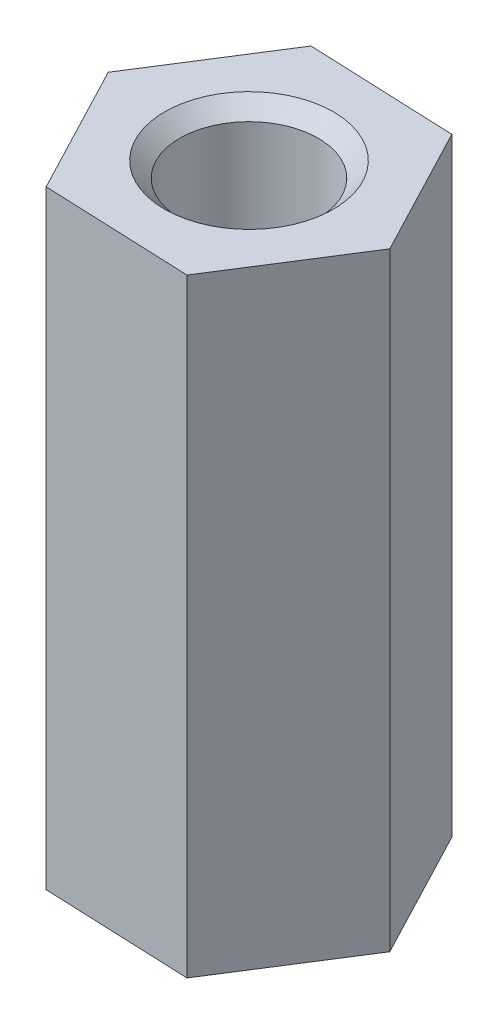
ISO-10303-21;
HEADER;
FILE_DESCRIPTION(('STEP AP214'),'2;1');
FILE_NAME('part.step','',(''),(''),'','','');
FILE_SCHEMA(('AUTOMOTIVE_DESIGN { 1 0 10303 214 1 1 1 1 }'));
ENDSEC;
DATA;
#1=APPLICATION_CONTEXT('core data for automotive mechanical design processes');
#2=APPLICATION_PROTOCOL_DEFINITION('international standard','automotive_design',2000,#1);
#3=PRODUCT_CONTEXT('',#1,'mechanical');
#4=PRODUCT('Part','Part','',(#3));
#5=PRODUCT_RELATED_PRODUCT_CATEGORY('part','',(#4));
#6=PRODUCT_DEFINITION_FORMATION('','',#4);
#7=PRODUCT_DEFINITION_CONTEXT('part definition',#1,'design');
#8=PRODUCT_DEFINITION('design','',#6,#7);
#9=PRODUCT_DEFINITION_SHAPE('','',#8);
#10=(LENGTH_UNIT() NAMED_UNIT(*) SI_UNIT(.MILLI.,.METRE.));
#11=(NAMED_UNIT(*) PLANE_ANGLE_UNIT() SI_UNIT($,.RADIAN.));
#12=(NAMED_UNIT(*) SI_UNIT($,.STERADIAN.) SOLID_ANGLE_UNIT());
#13=UNCERTAINTY_MEASURE_WITH_UNIT(LENGTH_MEASURE(1.E-05),#10,'distance_accuracy_value','');
#14=(GEOMETRIC_REPRESENTATION_CONTEXT(3) GLOBAL_UNCERTAINTY_ASSIGNED_CONTEXT((#13)) GLOBAL_UNIT_ASSIGNED_CONTEXT((#10,
#11,#12)) REPRESENTATION_CONTEXT('',''));
#15=CARTESIAN_POINT('',(0.,0.,0.));
#16=DIRECTION('',(0.,0.,1.));
#17=DIRECTION('',(1.,0.,0.));
#18=AXIS2_PLACEMENT_3D('',#15,#16,#17);
#19=CARTESIAN_POINT('',(0.,11.,0.));
#20=DIRECTION('',(0.,1.,0.));
#21=DIRECTION('',(0.,0.,1.));
#22=AXIS2_PLACEMENT_3D('',#19,#20,#21);
#23=PLANE('',#22);
#24=CARTESIAN_POINT('',(0.,11.,0.));
#25=DIRECTION('',(0.,1.,0.));
#26=DIRECTION('',(0.,0.,1.));
#27=AXIS2_PLACEMENT_3D('',#24,#25,#26);
#28=CIRCLE('',#27,1.525);
#29=CARTESIAN_POINT('',(0.,11.,1.525));
#30=VERTEX_POINT('',#29);
#31=EDGE_CURVE('E179',#30,#30,#28,.T.);
#32=ORIENTED_EDGE('',*,*,#31,.F.);
#33=EDGE_LOOP('',(#32));
#34=FACE_BOUND('',#33,.T.);
#35=DIRECTION('',(0.999145776971958,0.,0.0413245249107971));
#36=VECTOR('',#35,1.);
#37=CARTESIAN_POINT('',(-1.42181769887204,11.,2.24316021819832));
#38=LINE('',#37,#36);
#39=CARTESIAN_POINT('',(-1.42181769887204,11.,2.24316021819832));
#40=VERTEX_POINT('',#39);
#41=CARTESIAN_POINT('',(1.23172488428237,11.,2.35291035587268));
#42=VERTEX_POINT('',#41);
#43=EDGE_CURVE('E135',#40,#42,#38,.T.);
#44=ORIENTED_EDGE('',*,*,#43,.T.);
#45=DIRECTION('',(0.535360976858052,0.,-0.844623362486258));
#46=VECTOR('',#45,1.);
#47=CARTESIAN_POINT('',(1.23172488428237,11.,2.35291035587268));
#48=LINE('',#47,#46);
#49=CARTESIAN_POINT('',(2.65354258315441,11.,0.109750137674357));
#50=VERTEX_POINT('',#49);
#51=EDGE_CURVE('E94',#42,#50,#48,.T.);
#52=ORIENTED_EDGE('',*,*,#51,.T.);
#53=DIRECTION('',(-0.463784800113906,0.,-0.885947887397055));
#54=VECTOR('',#53,1.);
#55=CARTESIAN_POINT('',(2.65354258315441,11.,0.109750137674357));
#56=LINE('',#55,#54);
#57=CARTESIAN_POINT('',(1.42181769887204,11.,-2.24316021819832));
#58=VERTEX_POINT('',#57);
#59=EDGE_CURVE('E106',#50,#58,#56,.T.);
#60=ORIENTED_EDGE('',*,*,#59,.T.);
#61=DIRECTION('',(-0.999145776971957,0.,-0.0413245249107969));
#62=VECTOR('',#61,1.);
#63=CARTESIAN_POINT('',(1.42181769887204,11.,-2.24316021819832));
#64=LINE('',#63,#62);
#65=CARTESIAN_POINT('',(-1.23172488428237,11.,-2.35291035587268));
#66=VERTEX_POINT('',#65);
#67=EDGE_CURVE('E101',#58,#66,#64,.T.);
#68=ORIENTED_EDGE('',*,*,#67,.T.);
#69=DIRECTION('',(-0.535360976858052,0.,0.844623362486258));
#70=VECTOR('',#69,1.);
#71=CARTESIAN_POINT('',(-1.23172488428237,11.,-2.35291035587268));
#72=LINE('',#71,#70);
#73=CARTESIAN_POINT('',(-2.65354258315441,11.,-0.109750137674357));
#74=VERTEX_POINT('',#73);
#75=EDGE_CURVE('E104',#66,#74,#72,.T.);
#76=ORIENTED_EDGE('',*,*,#75,.T.);
#77=DIRECTION('',(0.463784800113906,0.,0.885947887397055));
#78=VECTOR('',#77,1.);
#79=CARTESIAN_POINT('',(-2.65354258315441,11.,-0.109750137674357));
#80=LINE('',#79,#78);
#81=EDGE_CURVE('E57',#74,#40,#80,.T.);
#82=ORIENTED_EDGE('',*,*,#81,.T.);
#83=EDGE_LOOP('',(#44,#52,#60,#68,#76,#82));
#84=FACE_BOUND('',#83,.T.);
#85=ADVANCED_FACE('F40',(#34,#84),#23,.T.);
#86=CARTESIAN_POINT('',(0.,0.,0.));
#87=DIRECTION('',(0.,1.,0.));
#88=DIRECTION('',(0.,0.,1.));
#89=AXIS2_PLACEMENT_3D('',#86,#87,#88);
#90=PLANE('',#89);
#91=CARTESIAN_POINT('',(0.,0.,0.));
#92=DIRECTION('',(0.,1.,0.));
#93=DIRECTION('',(0.,0.,1.));
#94=AXIS2_PLACEMENT_3D('',#91,#92,#93);
#95=CIRCLE('',#94,1.25);
#96=CARTESIAN_POINT('',(0.,0.,1.25));
#97=VERTEX_POINT('',#96);
#98=EDGE_CURVE('E128',#97,#97,#95,.T.);
#99=ORIENTED_EDGE('',*,*,#98,.T.);
#100=EDGE_LOOP('',(#99));
#101=FACE_BOUND('',#100,.T.);
#102=DIRECTION('',(0.999145776971958,0.,0.0413245249107971));
#103=VECTOR('',#102,1.);
#104=CARTESIAN_POINT('',(-1.42181769887204,0.,2.24316021819832));
#105=LINE('',#104,#103);
#106=CARTESIAN_POINT('',(-1.42181769887204,0.,2.24316021819832));
#107=VERTEX_POINT('',#106);
#108=CARTESIAN_POINT('',(1.23172488428237,0.,2.35291035587268));
#109=VERTEX_POINT('',#108);
#110=EDGE_CURVE('E124',#107,#109,#105,.T.);
#111=ORIENTED_EDGE('',*,*,#110,.F.);
#112=DIRECTION('',(0.463784800113906,0.,0.885947887397055));
#113=VECTOR('',#112,1.);
#114=CARTESIAN_POINT('',(-2.65354258315441,0.,-0.109750137674357));
#115=LINE('',#114,#113);
#116=CARTESIAN_POINT('',(-2.65354258315441,0.,-0.109750137674357));
#117=VERTEX_POINT('',#116);
#118=EDGE_CURVE('E86',#117,#107,#115,.T.);
#119=ORIENTED_EDGE('',*,*,#118,.F.);
#120=DIRECTION('',(-0.535360976858052,0.,0.844623362486258));
#121=VECTOR('',#120,1.);
#122=CARTESIAN_POINT('',(-1.23172488428237,0.,-2.35291035587268));
#123=LINE('',#122,#121);
#124=CARTESIAN_POINT('',(-1.23172488428237,0.,-2.35291035587268));
#125=VERTEX_POINT('',#124);
#126=EDGE_CURVE('E80',#125,#117,#123,.T.);
#127=ORIENTED_EDGE('',*,*,#126,.F.);
#128=DIRECTION('',(-0.999145776971957,0.,-0.0413245249107969));
#129=VECTOR('',#128,1.);
#130=CARTESIAN_POINT('',(1.42181769887204,0.,-2.24316021819832));
#131=LINE('',#130,#129);
#132=CARTESIAN_POINT('',(1.42181769887204,0.,-2.24316021819832));
#133=VERTEX_POINT('',#132);
#134=EDGE_CURVE('E114',#133,#125,#131,.T.);
#135=ORIENTED_EDGE('',*,*,#134,.F.);
#136=DIRECTION('',(-0.463784800113906,0.,-0.885947887397055));
#137=VECTOR('',#136,1.);
#138=CARTESIAN_POINT('',(2.65354258315441,0.,0.109750137674357));
#139=LINE('',#138,#137);
#140=CARTESIAN_POINT('',(2.65354258315441,0.,0.109750137674357));
#141=VERTEX_POINT('',#140);
#142=EDGE_CURVE('E130',#141,#133,#139,.T.);
#143=ORIENTED_EDGE('',*,*,#142,.F.);
#144=DIRECTION('',(0.535360976858052,0.,-0.844623362486258));
#145=VECTOR('',#144,1.);
#146=CARTESIAN_POINT('',(1.23172488428237,0.,2.35291035587268));
#147=LINE('',#146,#145);
#148=EDGE_CURVE('E127',#109,#141,#147,.T.);
#149=ORIENTED_EDGE('',*,*,#148,.F.);
#150=EDGE_LOOP('',(#111,#119,#127,#135,#143,#149));
#151=FACE_BOUND('',#150,.T.);
#152=ADVANCED_FACE('F144',(#101,#151),#90,.F.);
#153=CARTESIAN_POINT('',(-1.42181769887204,11.,2.24316021819832));
#154=DIRECTION('',(0.0413245249107971,0.,-0.999145776971958));
#155=DIRECTION('',(-0.999145776971958,0.,-0.0413245249107971));
#156=AXIS2_PLACEMENT_3D('',#153,#154,#155);
#157=PLANE('',#156);
#158=ORIENTED_EDGE('',*,*,#110,.T.);
#159=DIRECTION('',(0.,-1.,0.));
#160=VECTOR('',#159,1.);
#161=CARTESIAN_POINT('',(1.23172488428237,11.,2.35291035587268));
#162=LINE('',#161,#160);
#163=EDGE_CURVE('E11',#42,#109,#162,.T.);
#164=ORIENTED_EDGE('',*,*,#163,.F.);
#165=ORIENTED_EDGE('',*,*,#43,.F.);
#166=DIRECTION('',(0.,-1.,0.));
#167=VECTOR('',#166,1.);
#168=CARTESIAN_POINT('',(-1.42181769887204,11.,2.24316021819832));
#169=LINE('',#168,#167);
#170=EDGE_CURVE('E120',#40,#107,#169,.T.);
#171=ORIENTED_EDGE('',*,*,#170,.T.);
#172=EDGE_LOOP('',(#158,#164,#165,#171));
#173=FACE_BOUND('',#172,.T.);
#174=ADVANCED_FACE('F42',(#173),#157,.F.);
#175=CARTESIAN_POINT('',(1.23172488428237,11.,2.35291035587268));
#176=DIRECTION('',(-0.844623362486258,0.,-0.535360976858052));
#177=DIRECTION('',(-0.535360976858052,0.,0.844623362486258));
#178=AXIS2_PLACEMENT_3D('',#175,#176,#177);
#179=PLANE('',#178);
#180=ORIENTED_EDGE('',*,*,#148,.T.);
#181=DIRECTION('',(0.,-1.,0.));
#182=VECTOR('',#181,1.);
#183=CARTESIAN_POINT('',(2.65354258315441,11.,0.109750137674357));
#184=LINE('',#183,#182);
#185=EDGE_CURVE('E49',#50,#141,#184,.T.);
#186=ORIENTED_EDGE('',*,*,#185,.F.);
#187=ORIENTED_EDGE('',*,*,#51,.F.);
#188=ORIENTED_EDGE('',*,*,#163,.T.);
#189=EDGE_LOOP('',(#180,#186,#187,#188));
#190=FACE_BOUND('',#189,.T.);
#191=ADVANCED_FACE('F239',(#190),#179,.F.);
#192=CARTESIAN_POINT('',(2.65354258315441,11.,0.109750137674357));
#193=DIRECTION('',(-0.885947887397055,0.,0.463784800113906));
#194=DIRECTION('',(0.463784800113906,0.,0.885947887397055));
#195=AXIS2_PLACEMENT_3D('',#192,#193,#194);
#196=PLANE('',#195);
#197=ORIENTED_EDGE('',*,*,#142,.T.);
#198=DIRECTION('',(0.,-1.,0.));
#199=VECTOR('',#198,1.);
#200=CARTESIAN_POINT('',(1.42181769887204,11.,-2.24316021819832));
#201=LINE('',#200,#199);
#202=EDGE_CURVE('E115',#58,#133,#201,.T.);
#203=ORIENTED_EDGE('',*,*,#202,.F.);
#204=ORIENTED_EDGE('',*,*,#59,.F.);
#205=ORIENTED_EDGE('',*,*,#185,.T.);
#206=EDGE_LOOP('',(#197,#203,#204,#205));
#207=FACE_BOUND('',#206,.T.);
#208=ADVANCED_FACE('F141',(#207),#196,.F.);
#209=CARTESIAN_POINT('',(1.42181769887204,11.,-2.24316021819832));
#210=DIRECTION('',(-0.041324524910797,0.,0.999145776971958));
#211=DIRECTION('',(0.999145776971958,0.,0.041324524910797));
#212=AXIS2_PLACEMENT_3D('',#209,#210,#211);
#213=PLANE('',#212);
#214=ORIENTED_EDGE('',*,*,#134,.T.);
#215=DIRECTION('',(0.,-1.,0.));
#216=VECTOR('',#215,1.);
#217=CARTESIAN_POINT('',(-1.23172488428237,11.,-2.35291035587268));
#218=LINE('',#217,#216);
#219=EDGE_CURVE('E111',#66,#125,#218,.T.);
#220=ORIENTED_EDGE('',*,*,#219,.F.);
#221=ORIENTED_EDGE('',*,*,#67,.F.);
#222=ORIENTED_EDGE('',*,*,#202,.T.);
#223=EDGE_LOOP('',(#214,#220,#221,#222));
#224=FACE_BOUND('',#223,.T.);
#225=ADVANCED_FACE('F112',(#224),#213,.F.);
#226=CARTESIAN_POINT('',(-1.23172488428237,11.,-2.35291035587268));
#227=DIRECTION('',(0.844623362486258,0.,0.535360976858052));
#228=DIRECTION('',(0.535360976858052,0.,-0.844623362486258));
#229=AXIS2_PLACEMENT_3D('',#226,#227,#228);
#230=PLANE('',#229);
#231=ORIENTED_EDGE('',*,*,#126,.T.);
#232=DIRECTION('',(0.,-1.,0.));
#233=VECTOR('',#232,1.);
#234=CARTESIAN_POINT('',(-2.65354258315441,11.,-0.109750137674357));
#235=LINE('',#234,#233);
#236=EDGE_CURVE('E116',#74,#117,#235,.T.);
#237=ORIENTED_EDGE('',*,*,#236,.F.);
#238=ORIENTED_EDGE('',*,*,#75,.F.);
#239=ORIENTED_EDGE('',*,*,#219,.T.);
#240=EDGE_LOOP('',(#231,#237,#238,#239));
#241=FACE_BOUND('',#240,.T.);
#242=ADVANCED_FACE('F118',(#241),#230,.F.);
#243=CARTESIAN_POINT('',(-2.65354258315441,11.,-0.109750137674357));
#244=DIRECTION('',(0.885947887397055,0.,-0.463784800113906));
#245=DIRECTION('',(-0.463784800113906,0.,-0.885947887397055));
#246=AXIS2_PLACEMENT_3D('',#243,#244,#245);
#247=PLANE('',#246);
#248=ORIENTED_EDGE('',*,*,#118,.T.);
#249=ORIENTED_EDGE('',*,*,#170,.F.);
#250=ORIENTED_EDGE('',*,*,#81,.F.);
#251=ORIENTED_EDGE('',*,*,#236,.T.);
#252=EDGE_LOOP('',(#248,#249,#250,#251));
#253=FACE_BOUND('',#252,.T.);
#254=ADVANCED_FACE('F148',(#253),#247,.F.);
#255=CARTESIAN_POINT('',(0.,11.,0.));
#256=DIRECTION('',(0.,1.,0.));
#257=DIRECTION('',(0.,0.,1.));
#258=AXIS2_PLACEMENT_3D('',#255,#256,#257);
#259=CYLINDRICAL_SURFACE('',#258,1.25);
#260=ORIENTED_EDGE('',*,*,#98,.F.);
#261=EDGE_LOOP('',(#260));
#262=FACE_BOUND('',#261,.T.);
#263=CARTESIAN_POINT('',(0.,10.725,0.));
#264=DIRECTION('',(0.,1.,0.));
#265=DIRECTION('',(0.,0.,1.));
#266=AXIS2_PLACEMENT_3D('',#263,#264,#265);
#267=CIRCLE('',#266,1.25);
#268=CARTESIAN_POINT('',(0.,10.725,1.25));
#269=VERTEX_POINT('',#268);
#270=EDGE_CURVE('E177',#269,#269,#267,.T.);
#271=ORIENTED_EDGE('',*,*,#270,.T.);
#272=EDGE_LOOP('',(#271));
#273=FACE_BOUND('',#272,.T.);
#274=ADVANCED_FACE('F150',(#262,#273),#259,.F.);
#275=CARTESIAN_POINT('',(0.,11.,0.));
#276=DIRECTION('',(0.,1.,0.));
#277=DIRECTION('',(0.,0.,1.));
#278=AXIS2_PLACEMENT_3D('',#275,#276,#277);
#279=CONICAL_SURFACE('',#278,1.525,0.785398163397448);
#280=ORIENTED_EDGE('',*,*,#270,.F.);
#281=EDGE_LOOP('',(#280));
#282=FACE_BOUND('',#281,.T.);
#283=ORIENTED_EDGE('',*,*,#31,.T.);
#284=EDGE_LOOP('',(#283));
#285=FACE_BOUND('',#284,.T.);
#286=ADVANCED_FACE('F156',(#282,#285),#279,.F.);
#287=CLOSED_SHELL('',(#85,#152,#174,#191,#208,#225,#242,#254,#274,#286));
#288=MANIFOLD_SOLID_BREP('B2',#287);
#289=ADVANCED_BREP_SHAPE_REPRESENTATION('',(#18,#288),#14);
#290=SHAPE_DEFINITION_REPRESENTATION(#9,#289);
ENDSEC;
END-ISO-10303-21;
